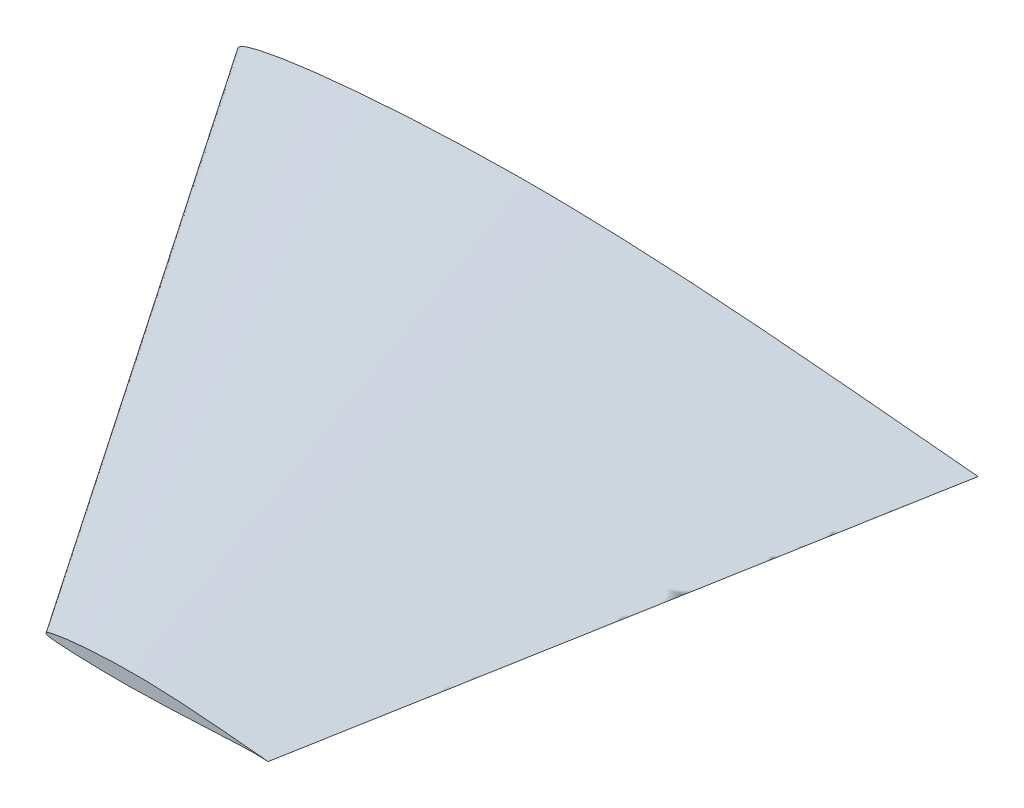
ISO-10303-21;
HEADER;
FILE_DESCRIPTION(('STEP AP214'),'2;1');
FILE_NAME('part.step','',(''),(''),'','','');
FILE_SCHEMA(('AUTOMOTIVE_DESIGN { 1 0 10303 214 1 1 1 1 }'));
ENDSEC;
DATA;
#1=APPLICATION_CONTEXT('core data for automotive mechanical design processes');
#2=APPLICATION_PROTOCOL_DEFINITION('international standard','automotive_design',2000,#1);
#3=PRODUCT_CONTEXT('',#1,'mechanical');
#4=PRODUCT('Part','Part','',(#3));
#5=PRODUCT_RELATED_PRODUCT_CATEGORY('part','',(#4));
#6=PRODUCT_DEFINITION_FORMATION('','',#4);
#7=PRODUCT_DEFINITION_CONTEXT('part definition',#1,'design');
#8=PRODUCT_DEFINITION('design','',#6,#7);
#9=PRODUCT_DEFINITION_SHAPE('','',#8);
#10=(LENGTH_UNIT() NAMED_UNIT(*) SI_UNIT(.MILLI.,.METRE.));
#11=(NAMED_UNIT(*) PLANE_ANGLE_UNIT() SI_UNIT($,.RADIAN.));
#12=(NAMED_UNIT(*) SI_UNIT($,.STERADIAN.) SOLID_ANGLE_UNIT());
#13=UNCERTAINTY_MEASURE_WITH_UNIT(LENGTH_MEASURE(1.E-05),#10,'distance_accuracy_value','');
#14=(GEOMETRIC_REPRESENTATION_CONTEXT(3) GLOBAL_UNCERTAINTY_ASSIGNED_CONTEXT((#13)) GLOBAL_UNIT_ASSIGNED_CONTEXT((#10,
#11,#12)) REPRESENTATION_CONTEXT('',''));
#15=CARTESIAN_POINT('',(0.,0.,0.));
#16=DIRECTION('',(0.,0.,1.));
#17=DIRECTION('',(1.,0.,0.));
#18=AXIS2_PLACEMENT_3D('',#15,#16,#17);
#19=CARTESIAN_POINT('',(3.63336270594469,13.6773950384951,0.));
#20=DIRECTION('',(0.,0.,-1.));
#21=DIRECTION('',(-1.,0.,0.));
#22=AXIS2_PLACEMENT_3D('',#19,#20,#21);
#23=PLANE('',#22);
#24=CARTESIAN_POINT('',(7973.1108,0.,0.));
#25=CARTESIAN_POINT('',(7973.4448166001,3.46874014402135,0.));
#26=CARTESIAN_POINT('',(7513.35192526295,42.1095353200564,0.));
#27=CARTESIAN_POINT('',(7193.44215496458,73.6677397091142,0.));
#28=CARTESIAN_POINT('',(6774.32823659022,112.953255344962,0.));
#29=CARTESIAN_POINT('',(6381.57455021336,149.054003977954,0.));
#30=CARTESIAN_POINT('',(5981.54840265774,184.478412710469,0.));
#31=CARTESIAN_POINT('',(5583.1806313874,216.671439350574,0.));
#32=CARTESIAN_POINT('',(5184.16839394543,246.191775981778,0.));
#33=CARTESIAN_POINT('',(4785.14294080162,271.971704733381,0.));
#34=CARTESIAN_POINT('',(4385.93372186477,293.375186775475,0.));
#35=CARTESIAN_POINT('',(3986.62898989573,310.186712132831,0.));
#36=CARTESIAN_POINT('',(3587.22077108428,321.049488011114,0.));
#37=CARTESIAN_POINT('',(3187.72703045812,325.856143484214,0.));
#38=CARTESIAN_POINT('',(2788.21885567217,320.645314873363,0.));
#39=CARTESIAN_POINT('',(2388.74252319517,310.365023761055,0.));
#40=CARTESIAN_POINT('',(1989.27135752529,293.539444554607,0.));
#41=CARTESIAN_POINT('',(1589.89553977371,269.670591450077,0.));
#42=CARTESIAN_POINT('',(1190.53675779631,238.430529670785,0.));
#43=CARTESIAN_POINT('',(858.032623246036,204.092940106485,0.));
#44=CARTESIAN_POINT('',(592.257617323616,169.402226480061,0.));
#45=CARTESIAN_POINT('',(392.778817261241,138.475561135967,0.));
#46=CARTESIAN_POINT('',(226.558327033441,105.06444026062,0.));
#47=CARTESIAN_POINT('',(114.526592139015,76.5641078591145,0.));
#48=CARTESIAN_POINT('',(61.8452525418591,55.7366630871479,0.));
#49=CARTESIAN_POINT('',(27.0243115347872,39.6533792528604,0.));
#50=CARTESIAN_POINT('',(-21.839097958613,-1.93112464848451,0.));
#51=CARTESIAN_POINT('',(33.3182814596933,-32.9810750225126,0.));
#52=CARTESIAN_POINT('',(69.4086652408865,-43.6825774278135,0.));
#53=CARTESIAN_POINT('',(123.603744942539,-56.5528772402976,0.));
#54=CARTESIAN_POINT('',(236.673192392193,-71.2511390940187,0.));
#55=CARTESIAN_POINT('',(403.659549417035,-87.6018865906431,0.));
#56=CARTESIAN_POINT('',(603.216509319253,-101.416050326465,0.));
#57=CARTESIAN_POINT('',(868.917329235554,-116.541219352788,0.));
#58=CARTESIAN_POINT('',(1200.84742357304,-130.223413671875,0.));
#59=CARTESIAN_POINT('',(1599.03883673265,-142.166839011258,0.));
#60=CARTESIAN_POINT('',(1997.07668183721,-150.2218451372,0.));
#61=CARTESIAN_POINT('',(2395.00450857896,-154.872807674681,0.));
#62=CARTESIAN_POINT('',(2792.90039356478,-155.963158331207,0.));
#63=CARTESIAN_POINT('',(3190.7984761954,-154.606723582166,0.));
#64=CARTESIAN_POINT('',(3588.69644740511,-146.022296253635,0.));
#65=CARTESIAN_POINT('',(3986.63818336044,-133.867597802096,0.));
#66=CARTESIAN_POINT('',(4384.6437589319,-118.35025163061,0.));
#67=CARTESIAN_POINT('',(4782.76624605711,-100.721138210546,0.));
#68=CARTESIAN_POINT('',(5180.98251706343,-81.5014025774358,0.));
#69=CARTESIAN_POINT('',(5579.45164455538,-61.1986948156736,0.));
#70=CARTESIAN_POINT('',(5977.58472764446,-41.0889165997257,0.));
#71=CARTESIAN_POINT('',(6377.78458372882,-21.7450095880476,0.));
#72=CARTESIAN_POINT('',(6771.07982958238,-3.94920269302418,0.));
#73=CARTESIAN_POINT('',(7191.07495840618,6.92113723208039,0.));
#74=CARTESIAN_POINT('',(7512.39898559307,21.2387947937664,0.));
#75=CARTESIAN_POINT('',(7972.77717169572,-3.46470771772588,0.));
#76=CARTESIAN_POINT('',(7973.1108,0.,0.));
#77=B_SPLINE_CURVE_WITH_KNOTS('',3,(#24,#25,#26,#27,#28,#29,#30,#31,#32,#33,#34,#35,#36,#37,#38,
#39,#40,#41,#42,#43,#44,#45,#46,#47,#48,#49,#50,#51,#52,#53,#54,#55,#56,#57,#58,#59,#60,#61,#62,
#63,#64,#65,#66,#67,#68,#69,#70,#71,#72,#73,#74,#75,#76),.UNSPECIFIED.,.T.,.F.,(4,1,1,1,1,1,1,1,
1,1,1,1,1,1,1,1,1,1,1,1,1,1,1,1,1,1,1,1,1,1,1,1,1,1,1,1,1,1,1,1,1,1,1,1,1,1,1,1,1,1,4),(0.,
0.0249563216438452,0.0499048911093339,0.0748697174485318,0.0998339759735948,0.124804651794424,
0.149775975466089,0.17473807802202,0.199694365081523,0.224644779849108,0.249585991084216,
0.274519879090468,0.299450900512802,0.324382082920327,0.349320412879847,0.374267429508116,
0.399236795566711,0.424224779613456,0.449261788021346,0.461813939794314,0.474399166054982,
0.487067083801195,0.493486614265045,0.496129330417317,0.497491232567908,0.501025389838791,
0.504501623345962,0.505834490100924,0.50842332671288,0.514754852870914,0.527287060327391,
0.539769148741578,0.552224474644191,0.577107285743186,0.601968705923853,0.626809027310946,
0.651645839739299,0.676476126974173,0.701306648462811,0.72614179351435,0.750988443635524,
0.775846921158433,0.800716114484763,0.825599827674277,0.850496417313331,0.875397726516232,
0.900311499999499,0.925233659143162,0.950150864559558,0.975072690194303,1.),.UNSPECIFIED.);
#78=CARTESIAN_POINT('',(7973.1108,0.,0.));
#79=VERTEX_POINT('',#78);
#80=EDGE_CURVE('E11',#79,#79,#77,.T.);
#81=ORIENTED_EDGE('',*,*,#80,.F.);
#82=EDGE_LOOP('',(#81));
#83=FACE_BOUND('',#82,.T.);
#84=ADVANCED_FACE('F55',(#83),#23,.T.);
#85=CARTESIAN_POINT('',(4417.89607301044,4.10345159362259,6480.44424));
#86=DIRECTION('',(0.,0.,-1.));
#87=DIRECTION('',(-1.,0.,0.));
#88=AXIS2_PLACEMENT_3D('',#85,#86,#87);
#89=PLANE('',#88);
#90=CARTESIAN_POINT('',(6808.8764,0.,6480.44424));
#91=CARTESIAN_POINT('',(6808.97661259504,1.04067801908643,6480.44424));
#92=CARTESIAN_POINT('',(6670.94082224861,12.6335771494452,6480.44424));
#93=CARTESIAN_POINT('',(6574.96238666733,22.1015686514406,6480.44424));
#94=CARTESIAN_POINT('',(6449.22100585641,33.887938822516,6480.44424));
#95=CARTESIAN_POINT('',(6331.38814673454,44.7187800811825,6480.44424));
#96=CARTESIAN_POINT('',(6211.37341659721,55.3466835585677,6480.44424));
#97=CARTESIAN_POINT('',(6091.8562338637,65.0051605977607,6480.44424));
#98=CARTESIAN_POINT('',(5972.14569391376,73.861766136852,6480.44424));
#99=CARTESIAN_POINT('',(5852.43119754835,81.5962095537961,6480.44424));
#100=CARTESIAN_POINT('',(5732.66156381248,88.0176003571512,6480.44424));
#101=CARTESIAN_POINT('',(5612.86327557455,93.0613289171664,6480.44424));
#102=CARTESIAN_POINT('',(5493.03394310947,96.3203928492312,6480.44424));
#103=CARTESIAN_POINT('',(5373.17894919158,97.7624424316363,6480.44424));
#104=CARTESIAN_POINT('',(5253.31962371417,96.1991021261672,6480.44424));
#105=CARTESIAN_POINT('',(5133.46985330829,93.114840953922,6480.44424));
#106=CARTESIAN_POINT('',(5013.62163215555,88.0668895363902,6480.44424));
#107=CARTESIAN_POINT('',(4893.80201734064,80.9058210029668,6480.44424));
#108=CARTESIAN_POINT('',(4773.98750634705,71.5332626055982,6480.44424));
#109=CARTESIAN_POINT('',(4674.2305421954,61.2313743350323,6480.44424));
#110=CARTESIAN_POINT('',(4594.49346805573,50.8235789194601,6480.44424));
#111=CARTESIAN_POINT('',(4534.64639725993,41.5450354941425,6480.44424));
#112=CARTESIAN_POINT('',(4484.77738639665,31.5211417528946,6480.44424));
#113=CARTESIAN_POINT('',(4451.16594253976,22.9705495896221,6480.44424));
#114=CARTESIAN_POINT('',(4435.36063190756,16.7219746481048,6480.44424));
#115=CARTESIAN_POINT('',(4424.91376773553,11.8966853792995,6480.44424));
#116=CARTESIAN_POINT('',(4410.25389331106,-0.579361209114428,6480.44424));
#117=CARTESIAN_POINT('',(4426.80205354984,-9.8948965914022,6480.44424));
#118=CARTESIAN_POINT('',(4437.62979668603,-13.1055202707483,6480.44424));
#119=CARTESIAN_POINT('',(4453.88925864946,-16.9668272002865,6480.44424));
#120=CARTESIAN_POINT('',(4487.81203756447,-21.376552652583,6480.44424));
#121=CARTESIAN_POINT('',(4537.91081566489,-26.2820698919096,6480.44424));
#122=CARTESIAN_POINT('',(4597.78133441162,-30.426563138764,6480.44424));
#123=CARTESIAN_POINT('',(4677.4961527331,-34.9643895676749,6480.44424));
#124=CARTESIAN_POINT('',(4777.08088655997,-39.0692526391079,6480.44424));
#125=CARTESIAN_POINT('',(4896.54515400179,-42.652503632106,6480.44424));
#126=CARTESIAN_POINT('',(5015.96335583811,-45.069147693665,6480.44424));
#127=CARTESIAN_POINT('',(5135.34855032828,-46.464513623207,6480.44424));
#128=CARTESIAN_POINT('',(5254.72416218198,-46.7916391231494,6480.44424));
#129=CARTESIAN_POINT('',(5374.10043125535,-46.3846726394692,6480.44424));
#130=CARTESIAN_POINT('',(5493.4766686657,-43.8091936641694,6480.44424));
#131=CARTESIAN_POINT('',(5612.86603907555,-40.1626015544209,6480.44424));
#132=CARTESIAN_POINT('',(5732.27455816338,-35.5071037541425,6480.44424));
#133=CARTESIAN_POINT('',(5851.7181553533,-30.2180973557122,6480.44424));
#134=CARTESIAN_POINT('',(5971.18988781491,-24.4518088124811,6480.44424));
#135=CARTESIAN_POINT('',(6090.73747874756,-18.3606810972272,6480.44424));
#136=CARTESIAN_POINT('',(6210.18425183389,-12.3273832710142,6480.44424));
#137=CARTESIAN_POINT('',(6330.25109098092,-6.52387731632277,6480.44424));
#138=CARTESIAN_POINT('',(6448.24643489169,-1.18484085077497,6480.44424));
#139=CARTESIAN_POINT('',(6574.25220023771,2.07644174338328,6480.44424));
#140=CARTESIAN_POINT('',(6670.65493604578,6.37201684719386,6480.44424));
#141=CARTESIAN_POINT('',(6808.77630391349,-1.03946811259236,6480.44424));
#142=CARTESIAN_POINT('',(6808.8764,0.,6480.44424));
#143=B_SPLINE_CURVE_WITH_KNOTS('',3,(#90,#91,#92,#93,#94,#95,#96,#97,#98,#99,#100,#101,#102,
#103,#104,#105,#106,#107,#108,#109,#110,#111,#112,#113,#114,#115,#116,#117,#118,#119,#120,#121,
#122,#123,#124,#125,#126,#127,#128,#129,#130,#131,#132,#133,#134,#135,#136,#137,#138,#139,#140,
#141,#142),.UNSPECIFIED.,.T.,.F.,(4,1,1,1,1,1,1,1,1,1,1,1,1,1,1,1,1,1,1,1,1,1,1,1,1,1,1,1,1,1,1,
1,1,1,1,1,1,1,1,1,1,1,1,1,1,1,1,1,1,1,4),(0.,0.0249563229354852,0.0499048925109715,
0.0748697180953834,0.0998339766889383,0.124804650888372,0.149775977248968,0.174738078473658,
0.199694366885427,0.224644780024467,0.249585991017604,0.274519880276674,0.299450898817867,
0.324382082083749,0.349320414454885,0.374267426855883,0.399236794042932,0.424224780706047,
0.449261789248352,0.461813942195485,0.474399165901735,0.487067086048325,0.493486616323249,
0.496129329689899,0.497491231722996,0.501025389853601,0.504501622592063,0.505834490296906,
0.508423329190248,0.514754855011337,0.527287059842358,0.539769150993382,0.552224475682113,
0.577107286739591,0.601968704445382,0.626809024722456,0.65164584130129,0.676476126104316,
0.701306646757171,0.726141794661069,0.750988443570079,0.775846921329097,0.800716116034225,
0.825599828146557,0.850496419032737,0.875397725704265,0.900311500507441,0.925233659488561,
0.950150866114027,0.975072691626785,1.),.UNSPECIFIED.);
#144=CARTESIAN_POINT('',(6808.8764,0.,6480.44424));
#145=VERTEX_POINT('',#144);
#146=EDGE_CURVE('E66',#145,#145,#143,.T.);
#147=ORIENTED_EDGE('',*,*,#146,.T.);
#148=EDGE_LOOP('',(#147));
#149=FACE_BOUND('',#148,.T.);
#150=ADVANCED_FACE('F96',(#149),#89,.F.);
#151=CARTESIAN_POINT('',(4416.81567005005,1.09352175501843,6480.44424));
#152=CARTESIAN_POINT('',(0.851151996822575,7.47906175031536,0.));
#153=CARTESIAN_POINT('',(4417.2625853531,5.03257703158641,6480.44424));
#154=CARTESIAN_POINT('',(4.9588548113001,20.7579177393211,0.));
#155=CARTESIAN_POINT('',(4422.44433717392,9.69598303040368,6480.44424));
#156=CARTESIAN_POINT('',(23.5103542400172,35.8709800668791,0.));
#157=CARTESIAN_POINT('',(4428.97976120516,13.7087923944186,6480.44424));
#158=CARTESIAN_POINT('',(44.6750821026223,47.8060122583477,0.));
#159=CARTESIAN_POINT('',(4431.30042393946,14.8466101736556,6480.44424));
#160=CARTESIAN_POINT('',(52.3438398218595,51.3083203805871,0.));
#161=CARTESIAN_POINT('',(4436.58191527348,17.1854250117332,6480.44424));
#162=CARTESIAN_POINT('',(70.1797308910735,59.0316796688976,0.));
#163=CARTESIAN_POINT('',(4440.99697577869,18.9502837205707,6480.44424));
#164=CARTESIAN_POINT('',(84.9966008241069,64.8220035404898,0.));
#165=CARTESIAN_POINT('',(4454.3714659615,23.7405862781908,6480.44424));
#166=CARTESIAN_POINT('',(129.632299890819,80.4069269718609,0.));
#167=CARTESIAN_POINT('',(4464.7387862163,26.4234167520114,6480.44424));
#168=CARTESIAN_POINT('',(164.219033171571,89.177344008003,0.));
#169=CARTESIAN_POINT('',(4493.98585541102,33.3559840923549,6480.44424));
#170=CARTESIAN_POINT('',(261.756010844294,112.139344604393,0.));
#171=CARTESIAN_POINT('',(4514.37852276058,37.4711022673648,6480.44424));
#172=CARTESIAN_POINT('',(329.749882305864,125.770698336039,0.));
#173=CARTESIAN_POINT('',(4553.79192848165,44.502714347348,6480.44424));
#174=CARTESIAN_POINT('',(461.136497741484,149.073555044342,0.));
#175=CARTESIAN_POINT('',(4574.16825245991,47.6724072242199,6480.44424));
#176=CARTESIAN_POINT('',(529.060867530927,159.585271152951,0.));
#177=CARTESIAN_POINT('',(4613.5817907111,53.3094164417883,6480.44424));
#178=CARTESIAN_POINT('',(660.443466070323,178.302294957294,0.));
#179=CARTESIAN_POINT('',(4633.98525432961,55.9783006918449,6480.44424));
#180=CARTESIAN_POINT('',(728.455741814049,187.165497183918,0.));
#181=CARTESIAN_POINT('',(4693.32558668896,63.1949342077586,6480.44424));
#182=CARTESIAN_POINT('',(926.2549024272,211.138231813406,0.));
#183=CARTESIAN_POINT('',(4733.69514189209,67.3722755476837,6480.44424));
#184=CARTESIAN_POINT('',(1060.81726154483,225.015047673401,0.));
#185=CARTESIAN_POINT('',(4813.07044944449,74.5847536225243,6480.44424));
#186=CARTESIAN_POINT('',(1325.39312196521,248.979743405631,0.));
#187=CARTESIAN_POINT('',(4853.45085075171,77.7493280029081,6480.44424));
#188=CARTESIAN_POINT('',(1459.98939916641,259.494307222178,0.));
#189=CARTESIAN_POINT('',(4932.85494117696,83.2355518964157,6480.44424));
#190=CARTESIAN_POINT('',(1724.65830837409,277.724741412865,0.));
#191=CARTESIAN_POINT('',(4973.25602117578,85.654422203173,6480.44424));
#192=CARTESIAN_POINT('',(1859.32251461993,285.759313746105,0.));
#193=CARTESIAN_POINT('',(5052.67990571174,89.7079068908581,6480.44424));
#194=CARTESIAN_POINT('',(2124.05636340546,299.216539642247,0.));
#195=CARTESIAN_POINT('',(5093.08172680382,91.4137118217687,6480.44424));
#196=CARTESIAN_POINT('',(2258.72248210485,304.875914630406,0.));
#197=CARTESIAN_POINT('',(5172.51267052717,94.1157735265494,6480.44424));
#198=CARTESIAN_POINT('',(2523.47870727798,313.832381106468,0.));
#199=CARTESIAN_POINT('',(5212.92181046957,95.1594888969389,6480.44424));
#200=CARTESIAN_POINT('',(2658.1687502829,317.288701890367,0.));
#201=CARTESIAN_POINT('',(5292.35993501833,96.7053565991782,6480.44424));
#202=CARTESIAN_POINT('',(2922.94821117691,322.402604522722,0.));
#203=CARTESIAN_POINT('',(5332.76953923779,97.235377398946,6480.44424));
#204=CARTESIAN_POINT('',(3057.63941437722,324.139939046014,0.));
#205=CARTESIAN_POINT('',(5412.20865310894,97.2870146004847,6480.44424));
#206=CARTESIAN_POINT('',(3322.42134792886,324.235519398211,0.));
#207=CARTESIAN_POINT('',(5452.61899765742,96.8066500614419,6480.44424));
#208=CARTESIAN_POINT('',(3457.11452006328,322.603145999479,0.));
#209=CARTESIAN_POINT('',(5532.04971208913,95.2557287438392,6480.44424));
#210=CARTESIAN_POINT('',(3721.86732505273,317.387481898934,0.));
#211=CARTESIAN_POINT('',(5572.45066913692,94.1604526903876,6480.44424));
#212=CARTESIAN_POINT('',(3856.52878918813,313.713516386229,0.));
#213=CARTESIAN_POINT('',(5651.86338144469,91.4158835766772,6480.44424));
#214=CARTESIAN_POINT('',(4121.22107225713,304.520117113132,0.));
#215=CARTESIAN_POINT('',(5692.25516664917,89.7187840917227,6480.44424));
#216=CARTESIAN_POINT('',(4255.85181624819,298.842975097895,0.));
#217=CARTESIAN_POINT('',(5771.65238713343,85.9244479563486,6480.44424));
#218=CARTESIAN_POINT('',(4520.49239943123,286.160863803246,0.));
#219=CARTESIAN_POINT('',(5812.03715554129,83.7619165177708,6480.44424));
#220=CARTESIAN_POINT('',(4655.09958357578,278.935429668336,0.));
#221=CARTESIAN_POINT('',(5891.40786445774,79.0754722362154,6480.44424));
#222=CARTESIAN_POINT('',(4919.65119090759,263.281499442179,0.));
#223=CARTESIAN_POINT('',(5931.7722167278,76.4701918857853,6480.44424));
#224=CARTESIAN_POINT('',(5054.19050376587,254.582030385087,0.));
#225=CARTESIAN_POINT('',(6011.11967948617,70.9761556884733,6480.44424));
#226=CARTESIAN_POINT('',(5318.66593099549,236.241172473376,0.));
#227=CARTESIAN_POINT('',(6051.4806208675,67.992290033948,6480.44424));
#228=CARTESIAN_POINT('',(5453.19304749934,226.283105261084,0.));
#229=CARTESIAN_POINT('',(6130.7687208015,61.8589607968701,6480.44424));
#230=CARTESIAN_POINT('',(5717.46606142239,205.819521253111,0.));
#231=CARTESIAN_POINT('',(6171.07179670123,58.60355643245,6480.44424));
#232=CARTESIAN_POINT('',(5851.80374124985,194.957373390636,0.));
#233=CARTESIAN_POINT('',(6250.46292850919,51.8833173812653,6480.44424));
#234=CARTESIAN_POINT('',(6116.43823053222,172.533212563721,0.));
#235=CARTESIAN_POINT('',(6290.93019931153,48.3015332949992,6480.44424));
#236=CARTESIAN_POINT('',(6251.31054938058,160.587001563507,0.));
#237=CARTESIAN_POINT('',(6369.7641654545,41.1905896457527,6480.44424));
#238=CARTESIAN_POINT('',(6514.02016871073,136.879997350485,0.));
#239=CARTESIAN_POINT('',(6409.49424527272,37.5395029177059,6480.44424));
#240=CARTESIAN_POINT('',(6646.48350624085,124.702883967718,0.));
#241=CARTESIAN_POINT('',(6490.19391030931,30.0469275002586,6480.44424));
#242=CARTESIAN_POINT('',(6915.66894190551,99.7047273309486,0.));
#243=CARTESIAN_POINT('',(6532.58409243493,26.0738986817024,6480.44424));
#244=CARTESIAN_POINT('',(7056.82034564552,86.4708929416945,0.));
#245=CARTESIAN_POINT('',(6606.1715862408,19.0216745451318,6480.44424));
#246=CARTESIAN_POINT('',(7301.3414144155,63.0237794449298,0.));
#247=CARTESIAN_POINT('',(6638.58008884302,15.8258686993843,6480.44424));
#248=CARTESIAN_POINT('',(7409.88972997561,52.3354273939472,0.));
#249=CARTESIAN_POINT('',(6738.57455257059,6.95610745322243,6480.44424));
#250=CARTESIAN_POINT('',(7746.01094036473,22.5697216918163,0.));
#251=CARTESIAN_POINT('',(6808.18207205123,1.10740729528537,6480.44424));
#252=CARTESIAN_POINT('',(7976.05876146933,3.20849633642371,0.));
#253=CARTESIAN_POINT('',(6809.56422116351,-1.06956803113539,6480.44424));
#254=CARTESIAN_POINT('',(7970.12424904041,-3.32235414091332,0.));
#255=CARTESIAN_POINT('',(6740.50394250374,2.62397359500866,6480.44424));
#256=CARTESIAN_POINT('',(7737.97436582028,9.07327945316234,0.));
#257=CARTESIAN_POINT('',(6639.4699516026,4.94292339391268,6480.44424));
#258=CARTESIAN_POINT('',(7404.03411271716,16.4102385381507,0.));
#259=CARTESIAN_POINT('',(6606.75049935788,3.52452185694688,6480.44424));
#260=CARTESIAN_POINT('',(7295.50100298664,11.589430338301,0.));
#261=CARTESIAN_POINT('',(6533.15863654703,1.01635597540515,6480.44424));
#262=CARTESIAN_POINT('',(7049.45481624086,3.25571594519572,0.));
#263=CARTESIAN_POINT('',(6490.7354776949,-0.0851389811340448,6480.44424));
#264=CARTESIAN_POINT('',(6907.9124209179,-0.422494292345689,0.));
#265=CARTESIAN_POINT('',(6409.83784036979,-2.92748995222576,6480.44424));
#266=CARTESIAN_POINT('',(6638.47276384949,-9.94940167731791,0.));
#267=CARTESIAN_POINT('',(6370.03007676403,-4.72396345006778,6480.44424));
#268=CARTESIAN_POINT('',(6505.82604932506,-15.9537971490828,0.));
#269=CARTESIAN_POINT('',(6291.13204179337,-8.41542907341324,6480.44424));
#270=CARTESIAN_POINT('',(6242.79427058009,-28.2698496781351,0.));
#271=CARTESIAN_POINT('',(6250.65017019606,-10.371437733968,6480.44424));
#272=CARTESIAN_POINT('',(6107.85260725292,-34.7940222339529,0.));
#273=CARTESIAN_POINT('',(6171.27249175547,-14.2933371863379,6480.44424));
#274=CARTESIAN_POINT('',(5843.29027073139,-47.8721553177922,0.));
#275=CARTESIAN_POINT('',(6131.00065069204,-16.326974354949,6480.44424));
#276=CARTESIAN_POINT('',(5709.06128309564,-54.6524295050272,0.));
#277=CARTESIAN_POINT('',(6051.79573849405,-20.3449231886722,6480.44424));
#278=CARTESIAN_POINT('',(5445.05625307705,-68.0463780349145,0.));
#279=CARTESIAN_POINT('',(6011.48265101923,-22.3988325478549,6480.44424));
#280=CARTESIAN_POINT('',(5310.68619517504,-74.8906873054162,0.));
#281=CARTESIAN_POINT('',(5932.26400167107,-26.32993728858,6480.44424));
#282=CARTESIAN_POINT('',(5046.63979541218,-87.9853957800353,0.));
#283=CARTESIAN_POINT('',(5891.9794367696,-28.2748915363674,6480.44424));
#284=CARTESIAN_POINT('',(4912.36555534317,-94.4629943603375,0.));
#285=CARTESIAN_POINT('',(5812.80206287869,-31.9403900246025,6480.44424));
#286=CARTESIAN_POINT('',(4648.45527004663,-106.668512463996,0.));
#287=CARTESIAN_POINT('',(5772.52976535828,-33.7245883792461,6480.44424));
#288=CARTESIAN_POINT('',(4514.22160636236,-112.608358336245,0.));
#289=CARTESIAN_POINT('',(5693.37382366188,-37.0225344158221,6480.44424));
#290=CARTESIAN_POINT('',(4250.38297764816,-123.584778854111,0.));
#291=CARTESIAN_POINT('',(5653.11048499369,-38.5935516166397,6480.44424));
#292=CARTESIAN_POINT('',(4116.17915588555,-128.810534481013,0.));
#293=CARTESIAN_POINT('',(5573.97091931757,-41.3486381310582,6480.44424));
#294=CARTESIAN_POINT('',(3852.39482623447,-137.967915455562,0.));
#295=CARTESIAN_POINT('',(5533.71461703787,-42.5801781785972,6480.44424));
#296=CARTESIAN_POINT('',(3718.21441178971,-142.059350088186,0.));
#297=CARTESIAN_POINT('',(5454.59019642137,-44.6460619516251,6480.44424));
#298=CARTESIAN_POINT('',(3454.48065842168,-148.917927219952,0.));
#299=CARTESIAN_POINT('',(5414.34164030708,-45.5164899081178,6480.44424));
#300=CARTESIAN_POINT('',(3320.3261209726,-151.798138774131,0.));
#301=CARTESIAN_POINT('',(5335.22385029051,-46.5129791386342,6480.44424));
#302=CARTESIAN_POINT('',(3056.61460508056,-155.064156461304,0.));
#303=CARTESIAN_POINT('',(5294.97384219141,-46.654423654197,6480.44424));
#304=CARTESIAN_POINT('',(2922.45545547697,-155.516733183583,0.));
#305=CARTESIAN_POINT('',(5215.85613323595,-46.6836972125714,6480.44424));
#306=CARTESIAN_POINT('',(2658.74496596753,-155.595533371822,0.));
#307=CARTESIAN_POINT('',(5175.60756987147,-46.5748355867199,6480.44424));
#308=CARTESIAN_POINT('',(2524.59084229598,-155.22096987481,0.));
#309=CARTESIAN_POINT('',(5096.48289997828,-46.008171174424,6480.44424));
#310=CARTESIAN_POINT('',(2260.85722228413,-153.304900227316,0.));
#311=CARTESIAN_POINT('',(5056.22593229901,-45.5397339139165,6480.44424));
#312=CARTESIAN_POINT('',(2126.67517383662,-151.729954418448,0.));
#313=CARTESIAN_POINT('',(4977.09275898664,-44.2805402894885,6480.44424));
#314=CARTESIAN_POINT('',(1862.91348543362,-147.506813433059,0.));
#315=CARTESIAN_POINT('',(4936.83583924796,-43.4678587767911,6480.44424));
#316=CARTESIAN_POINT('',(1728.7317362926,-144.783840960039,0.));
#317=CARTESIAN_POINT('',(4857.67794582359,-41.4844354984206,6480.44424));
#318=CARTESIAN_POINT('',(1464.88792543175,-138.143092289502,0.));
#319=CARTESIAN_POINT('',(4817.39652047567,-40.2784931790219,6480.44424));
#320=CARTESIAN_POINT('',(1330.62471309244,-134.107277102332,0.));
#321=CARTESIAN_POINT('',(4738.19637371989,-37.4638273232268,6480.44424));
#322=CARTESIAN_POINT('',(1066.64065189649,-124.691396056296,0.));
#323=CARTESIAN_POINT('',(4697.89768658972,-35.8053367662109,6480.44424));
#324=CARTESIAN_POINT('',(932.320374375371,-119.138480293624,0.));
#325=CARTESIAN_POINT('',(4638.60176587082,-32.7478320040612,6480.44424));
#326=CARTESIAN_POINT('',(734.680543913806,-108.899714640152,0.));
#327=CARTESIAN_POINT('',(4618.21291383888,-31.5896462776539,6480.44424));
#328=CARTESIAN_POINT('',(666.723007869781,-105.021579331212,0.));
#329=CARTESIAN_POINT('',(4578.79799609022,-29.1095608226316,6480.44424));
#330=CARTESIAN_POINT('',(535.351659840764,-96.7181628508186,0.));
#331=CARTESIAN_POINT('',(4558.39428256079,-27.7000230347802,6480.44424));
#332=CARTESIAN_POINT('',(467.344058521748,-91.9879797683864,0.));
#333=CARTESIAN_POINT('',(4518.87933862976,-24.4118174238437,6480.44424));
#334=CARTESIAN_POINT('',(335.634336849706,-80.9410845113024,0.));
#335=CARTESIAN_POINT('',(4498.39056770103,-22.4123695710641,6480.44424));
#336=CARTESIAN_POINT('',(267.353183409986,-74.222217753328,0.));
#337=CARTESIAN_POINT('',(4468.90513175334,-18.9136192626401,6480.44424));
#338=CARTESIAN_POINT('',(169.106030480179,-62.4678659738618,0.));
#339=CARTESIAN_POINT('',(4458.43719918642,-17.558027856094,6480.44424));
#340=CARTESIAN_POINT('',(134.217429138437,-57.8114916250523,0.));
#341=CARTESIAN_POINT('',(4444.75942601798,-14.7829270718406,6480.44424));
#342=CARTESIAN_POINT('',(88.6191351547192,-48.2446983563338,0.));
#343=CARTESIAN_POINT('',(4440.19896882535,-13.7156488350913,6480.44424));
#344=CARTESIAN_POINT('',(73.5028826952816,-44.5942013752756,0.));
#345=CARTESIAN_POINT('',(4434.69609133359,-12.2245129838614,6480.44424));
#346=CARTESIAN_POINT('',(55.3778290756161,-39.5221609611627,0.));
#347=CARTESIAN_POINT('',(4432.31035579613,-11.5282088525534,6480.44424));
#348=CARTESIAN_POINT('',(47.3064954460774,-36.9584111829196,0.));
#349=CARTESIAN_POINT('',(4425.18106455279,-8.89472928219073,6480.44424));
#350=CARTESIAN_POINT('',(22.6076318881664,-26.9516889063343,0.));
#351=CARTESIAN_POINT('',(4417.83334859909,-4.84610040521012,6480.44424));
#352=CARTESIAN_POINT('',(-0.353313589507012,-12.7535848269488,0.));
#353=CARTESIAN_POINT('',(4416.76490475388,-0.0173254577009985,6480.44424));
#354=CARTESIAN_POINT('',(-0.0858096528192414,3.72448094753444,0.));
#355=CARTESIAN_POINT('',(4416.77395277151,0.725830908382868,6480.44424));
#356=CARTESIAN_POINT('',(0.467718757241724,6.23954784199488,0.));
#357=CARTESIAN_POINT('',(4416.81567005005,1.09352175501843,6480.44424));
#358=CARTESIAN_POINT('',(0.851151996822575,7.47906175031536,0.));
#359=B_SPLINE_SURFACE_WITH_KNOTS('',3,1,((#151,#152),(#153,#154),(#155,#156),(#157,#158),(#159,
#160),(#161,#162),(#163,#164),(#165,#166),(#167,#168),(#169,#170),(#171,#172),(#173,#174),(#175,
#176),(#177,#178),(#179,#180),(#181,#182),(#183,#184),(#185,#186),(#187,#188),(#189,#190),(#191,
#192),(#193,#194),(#195,#196),(#197,#198),(#199,#200),(#201,#202),(#203,#204),(#205,#206),(#207,
#208),(#209,#210),(#211,#212),(#213,#214),(#215,#216),(#217,#218),(#219,#220),(#221,#222),(#223,
#224),(#225,#226),(#227,#228),(#229,#230),(#231,#232),(#233,#234),(#235,#236),(#237,#238),(#239,
#240),(#241,#242),(#243,#244),(#245,#246),(#247,#248),(#249,#250),(#251,#252),(#253,#254),(#255,
#256),(#257,#258),(#259,#260),(#261,#262),(#263,#264),(#265,#266),(#267,#268),(#269,#270),(#271,
#272),(#273,#274),(#275,#276),(#277,#278),(#279,#280),(#281,#282),(#283,#284),(#285,#286),(#287,
#288),(#289,#290),(#291,#292),(#293,#294),(#295,#296),(#297,#298),(#299,#300),(#301,#302),(#303,
#304),(#305,#306),(#307,#308),(#309,#310),(#311,#312),(#313,#314),(#315,#316),(#317,#318),(#319,
#320),(#321,#322),(#323,#324),(#325,#326),(#327,#328),(#329,#330),(#331,#332),(#333,#334),(#335,
#336),(#337,#338),(#339,#340),(#341,#342),(#343,#344),(#345,#346),(#347,#348),(#349,#350),(#351,
#352),(#353,#354),(#355,#356),(#357,#358)),.UNSPECIFIED.,.T.,.F.,.F.,(4,1,1,1,1,1,1,1,1,1,1,1,1,
1,1,1,1,1,1,1,1,1,1,1,1,1,1,1,1,1,1,1,1,1,1,1,1,1,1,1,1,1,1,1,1,1,1,1,1,1,1,1,1,1,1,1,1,1,1,1,1,
1,1,1,1,1,1,1,1,1,1,1,1,1,1,1,1,1,1,1,1,1,1,1,1,1,1,1,1,1,1,1,1,1,1,1,1,1,1,1,1,4),(2,2),(0.,
0.0029696962661212,0.00325695203481013,0.0043315984167116,0.00461885406790663,
0.00697431456898401,0.00726156743455686,0.0133938450328339,0.0136810977094804,
0.0260617627790474,0.0263490178560711,0.0386469890397152,0.0389342415623207,0.0511991408126834,
0.0514863945094538,0.0762361492205729,0.0765234030517592,0.101224133267317,0.101511389714874,
0.126193499325912,0.126480756901923,0.151140515954182,0.151427769302921,0.176078845913702,
0.176366101674056,0.201010028321227,0.201297284939939,0.225941049743561,0.226228303481132,
0.250874937749813,0.251162192740201,0.275816148984921,0.276103403733339,0.300766563752506,
0.301053816872379,0.325722850812009,0.326010105284148,0.35068495336794,0.350972206508838,
0.375656277039605,0.375943532869434,0.400626952860434,0.400914207068867,0.425591211385497,
0.425878465662422,0.450556037724695,0.450843291246834,0.475504607190184,0.475791860822321,
0.500460928834029,0.500748183757806,0.525388238639726,0.525675492131021,0.550310064274471,
0.550597317643779,0.575227269690867,0.575514524269244,0.60014942883453,0.600436683250364,
0.625063202317796,0.625350458053541,0.649964511520698,0.650251764725068,0.674861101159752,
0.675148355611249,0.699744814349265,0.700032067723581,0.724614007675595,0.724901262428708,
0.749472485198505,0.749759740187727,0.774319135319679,0.774606389096737,0.799154280371218,
0.799441537000635,0.823984801859856,0.824272057653489,0.84881508909473,0.849102342456516,
0.873651901523083,0.87393915903535,0.898492222910176,0.898779479312424,0.923353643090843,
0.923640897018215,0.948236454189838,0.948523708075693,0.960691780092451,0.960979032764423,
0.973173868506638,0.973461123915447,0.985706075963115,0.985993328746469,0.992037602121149,
0.992324854567558,0.994626438733105,0.994913693460899,0.995959305488067,0.996246561165743,
0.999435538995238,0.999722793904204,1.),(0.,1.),.UNSPECIFIED.);
#360=ORIENTED_EDGE('',*,*,#146,.F.);
#361=EDGE_LOOP('',(#360));
#362=FACE_BOUND('',#361,.T.);
#363=ORIENTED_EDGE('',*,*,#80,.T.);
#364=EDGE_LOOP('',(#363));
#365=FACE_BOUND('',#364,.T.);
#366=ADVANCED_FACE('F104',(#362,#365),#359,.T.);
#367=CLOSED_SHELL('',(#84,#150,#366));
#368=MANIFOLD_SOLID_BREP('B2',#367);
#369=ADVANCED_BREP_SHAPE_REPRESENTATION('',(#18,#368),#14);
#370=SHAPE_DEFINITION_REPRESENTATION(#9,#369);
ENDSEC;
END-ISO-10303-21;
